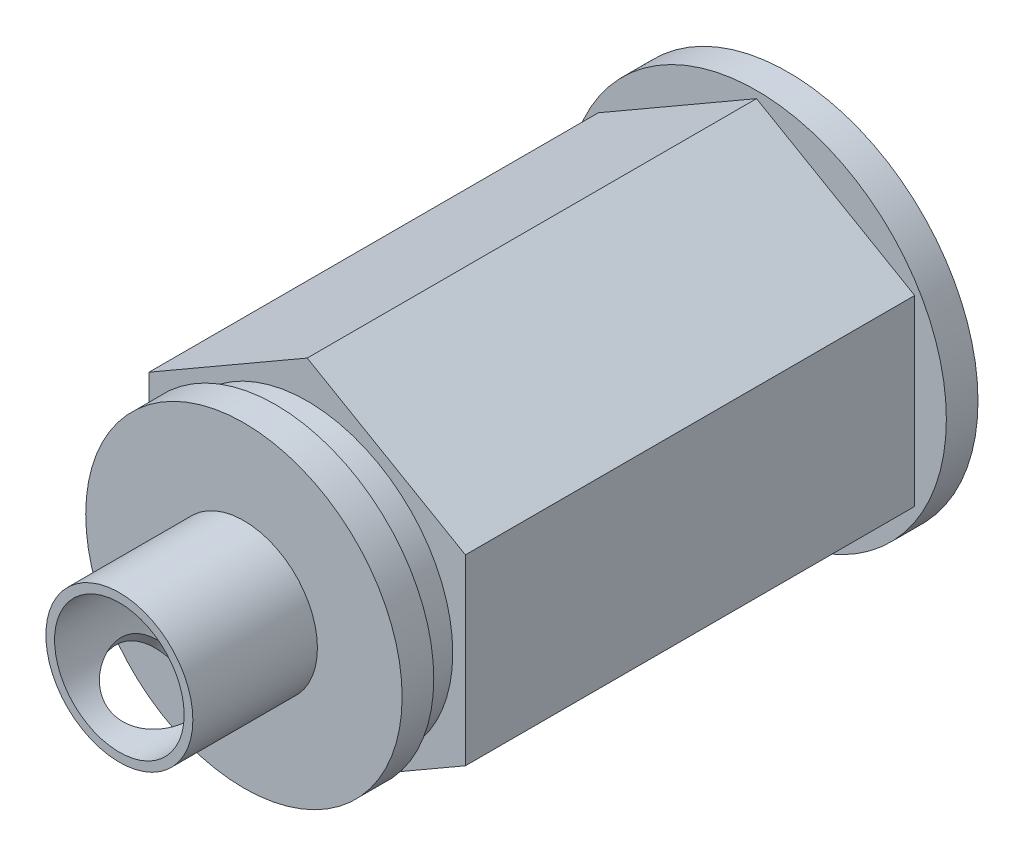
ISO-10303-21;
HEADER;
FILE_DESCRIPTION(('STEP AP214'),'2;1');
FILE_NAME('part.step','',(''),(''),'','','');
FILE_SCHEMA(('AUTOMOTIVE_DESIGN { 1 0 10303 214 1 1 1 1 }'));
ENDSEC;
DATA;
#1=APPLICATION_CONTEXT('core data for automotive mechanical design processes');
#2=APPLICATION_PROTOCOL_DEFINITION('international standard','automotive_design',2000,#1);
#3=PRODUCT_CONTEXT('',#1,'mechanical');
#4=PRODUCT('Part','Part','',(#3));
#5=PRODUCT_RELATED_PRODUCT_CATEGORY('part','',(#4));
#6=PRODUCT_DEFINITION_FORMATION('','',#4);
#7=PRODUCT_DEFINITION_CONTEXT('part definition',#1,'design');
#8=PRODUCT_DEFINITION('design','',#6,#7);
#9=PRODUCT_DEFINITION_SHAPE('','',#8);
#10=(LENGTH_UNIT() NAMED_UNIT(*) SI_UNIT(.MILLI.,.METRE.));
#11=(NAMED_UNIT(*) PLANE_ANGLE_UNIT() SI_UNIT($,.RADIAN.));
#12=(NAMED_UNIT(*) SI_UNIT($,.STERADIAN.) SOLID_ANGLE_UNIT());
#13=UNCERTAINTY_MEASURE_WITH_UNIT(LENGTH_MEASURE(1.E-05),#10,'distance_accuracy_value','');
#14=(GEOMETRIC_REPRESENTATION_CONTEXT(3) GLOBAL_UNCERTAINTY_ASSIGNED_CONTEXT((#13)) GLOBAL_UNIT_ASSIGNED_CONTEXT((#10,
#11,#12)) REPRESENTATION_CONTEXT('',''));
#15=CARTESIAN_POINT('',(0.,0.,0.));
#16=DIRECTION('',(0.,0.,1.));
#17=DIRECTION('',(1.,0.,0.));
#18=AXIS2_PLACEMENT_3D('',#15,#16,#17);
#19=CARTESIAN_POINT('',(0.,0.,21.844));
#20=DIRECTION('',(0.,0.,1.));
#21=DIRECTION('',(1.,0.,0.));
#22=AXIS2_PLACEMENT_3D('',#19,#20,#21);
#23=PLANE('',#22);
#24=CARTESIAN_POINT('',(0.,0.,21.844));
#25=DIRECTION('',(0.,0.,1.));
#26=DIRECTION('',(1.,0.,0.));
#27=AXIS2_PLACEMENT_3D('',#24,#25,#26);
#28=CIRCLE('',#27,2.525);
#29=CARTESIAN_POINT('',(2.525,0.,21.844));
#30=VERTEX_POINT('',#29);
#31=EDGE_CURVE('E170',#30,#30,#28,.T.);
#32=ORIENTED_EDGE('',*,*,#31,.F.);
#33=EDGE_LOOP('',(#32));
#34=FACE_BOUND('',#33,.T.);
#35=CARTESIAN_POINT('',(0.,0.,21.844));
#36=DIRECTION('',(0.,0.,1.));
#37=DIRECTION('',(1.,0.,0.));
#38=AXIS2_PLACEMENT_3D('',#35,#36,#37);
#39=CIRCLE('',#38,2.6);
#40=CARTESIAN_POINT('',(2.6,0.,21.844));
#41=VERTEX_POINT('',#40);
#42=EDGE_CURVE('E11',#41,#41,#39,.F.);
#43=ORIENTED_EDGE('',*,*,#42,.F.);
#44=EDGE_LOOP('',(#43));
#45=FACE_BOUND('',#44,.T.);
#46=ADVANCED_FACE('F33',(#34,#45),#23,.T.);
#47=CARTESIAN_POINT('',(0.,0.,19.304));
#48=DIRECTION('',(0.,0.,1.));
#49=DIRECTION('',(1.,0.,0.));
#50=AXIS2_PLACEMENT_3D('',#47,#48,#49);
#51=PLANE('',#50);
#52=DIRECTION('',(-0.866025403784441,0.499999999999995,0.));
#53=VECTOR('',#52,1.);
#54=CARTESIAN_POINT('',(6.34999999999996,3.6661742093542,19.304));
#55=LINE('',#54,#53);
#56=CARTESIAN_POINT('',(6.34999999999996,3.6661742093542,19.304));
#57=VERTEX_POINT('',#56);
#58=CARTESIAN_POINT('',(0.,7.33234841870825,19.304));
#59=VERTEX_POINT('',#58);
#60=EDGE_CURVE('E132',#57,#59,#55,.T.);
#61=ORIENTED_EDGE('',*,*,#60,.T.);
#62=DIRECTION('',(-0.866025403784438,-0.500000000000001,0.));
#63=VECTOR('',#62,1.);
#64=CARTESIAN_POINT('',(0.,7.33234841870825,19.304));
#65=LINE('',#64,#63);
#66=CARTESIAN_POINT('',(-6.35000000000001,3.66617420935411,19.304));
#67=VERTEX_POINT('',#66);
#68=EDGE_CURVE('E129',#59,#67,#65,.T.);
#69=ORIENTED_EDGE('',*,*,#68,.T.);
#70=DIRECTION('',(0.,-1.,0.));
#71=VECTOR('',#70,1.);
#72=CARTESIAN_POINT('',(-6.35000000000001,3.66617420935411,19.304));
#73=LINE('',#72,#71);
#74=CARTESIAN_POINT('',(-6.34999999999999,-3.66617420935416,19.304));
#75=VERTEX_POINT('',#74);
#76=EDGE_CURVE('E140',#67,#75,#73,.T.);
#77=ORIENTED_EDGE('',*,*,#76,.T.);
#78=DIRECTION('',(0.866025403784442,-0.499999999999995,0.));
#79=VECTOR('',#78,1.);
#80=CARTESIAN_POINT('',(-6.34999999999999,-3.66617420935416,19.304));
#81=LINE('',#80,#79);
#82=CARTESIAN_POINT('',(0.,-7.33234841870825,19.304));
#83=VERTEX_POINT('',#82);
#84=EDGE_CURVE('E142',#75,#83,#81,.T.);
#85=ORIENTED_EDGE('',*,*,#84,.T.);
#86=DIRECTION('',(0.866025403784435,0.500000000000007,0.));
#87=VECTOR('',#86,1.);
#88=CARTESIAN_POINT('',(0.,-7.33234841870825,19.304));
#89=LINE('',#88,#87);
#90=CARTESIAN_POINT('',(6.35000000000004,-3.66617420935407,19.304));
#91=VERTEX_POINT('',#90);
#92=EDGE_CURVE('E144',#83,#91,#89,.T.);
#93=ORIENTED_EDGE('',*,*,#92,.T.);
#94=DIRECTION('',(0.,1.,0.));
#95=VECTOR('',#94,1.);
#96=CARTESIAN_POINT('',(6.35000000000004,-3.66617420935407,19.304));
#97=LINE('',#96,#95);
#98=EDGE_CURVE('E61',#91,#57,#97,.T.);
#99=ORIENTED_EDGE('',*,*,#98,.T.);
#100=EDGE_LOOP('',(#61,#69,#77,#85,#93,#99));
#101=FACE_BOUND('',#100,.T.);
#102=CARTESIAN_POINT('',(0.,0.,19.304));
#103=DIRECTION('',(0.,0.,1.));
#104=DIRECTION('',(1.,0.,0.));
#105=AXIS2_PLACEMENT_3D('',#102,#103,#104);
#106=CIRCLE('',#105,5.842);
#107=CARTESIAN_POINT('',(5.842,0.,19.304));
#108=VERTEX_POINT('',#107);
#109=EDGE_CURVE('E161',#108,#108,#106,.T.);
#110=ORIENTED_EDGE('',*,*,#109,.F.);
#111=EDGE_LOOP('',(#110));
#112=FACE_BOUND('',#111,.T.);
#113=ADVANCED_FACE('F145',(#101,#112),#51,.T.);
#114=CARTESIAN_POINT('',(6.34999999999996,3.6661742093542,19.304));
#115=DIRECTION('',(-0.499999999999995,-0.866025403784441,0.));
#116=DIRECTION('',(0.866025403784441,-0.499999999999995,0.));
#117=AXIS2_PLACEMENT_3D('',#114,#115,#116);
#118=PLANE('',#117);
#119=DIRECTION('',(0.,0.,-1.));
#120=VECTOR('',#119,1.);
#121=CARTESIAN_POINT('',(6.34999999999996,3.6661742093542,19.304));
#122=LINE('',#121,#120);
#123=CARTESIAN_POINT('',(6.34999999999996,3.6661742093542,1.27));
#124=VERTEX_POINT('',#123);
#125=EDGE_CURVE('E110',#57,#124,#122,.T.);
#126=ORIENTED_EDGE('',*,*,#125,.T.);
#127=DIRECTION('',(-0.866025403784441,0.499999999999995,0.));
#128=VECTOR('',#127,1.);
#129=CARTESIAN_POINT('',(6.34999999999996,3.6661742093542,1.27));
#130=LINE('',#129,#128);
#131=CARTESIAN_POINT('',(0.,7.33234841870825,1.27));
#132=VERTEX_POINT('',#131);
#133=EDGE_CURVE('E53',#124,#132,#130,.T.);
#134=ORIENTED_EDGE('',*,*,#133,.T.);
#135=DIRECTION('',(0.,0.,-1.));
#136=VECTOR('',#135,1.);
#137=CARTESIAN_POINT('',(0.,7.33234841870825,19.304));
#138=LINE('',#137,#136);
#139=EDGE_CURVE('E96',#59,#132,#138,.T.);
#140=ORIENTED_EDGE('',*,*,#139,.F.);
#141=ORIENTED_EDGE('',*,*,#60,.F.);
#142=EDGE_LOOP('',(#126,#134,#140,#141));
#143=FACE_BOUND('',#142,.T.);
#144=ADVANCED_FACE('F35',(#143),#118,.F.);
#145=CARTESIAN_POINT('',(0.,7.33234841870825,19.304));
#146=DIRECTION('',(0.500000000000001,-0.866025403784438,0.));
#147=DIRECTION('',(0.866025403784438,0.500000000000001,0.));
#148=AXIS2_PLACEMENT_3D('',#145,#146,#147);
#149=PLANE('',#148);
#150=ORIENTED_EDGE('',*,*,#139,.T.);
#151=DIRECTION('',(-0.866025403784438,-0.500000000000001,0.));
#152=VECTOR('',#151,1.);
#153=CARTESIAN_POINT('',(0.,7.33234841870825,1.27));
#154=LINE('',#153,#152);
#155=CARTESIAN_POINT('',(-6.35000000000001,3.66617420935411,1.27));
#156=VERTEX_POINT('',#155);
#157=EDGE_CURVE('E128',#132,#156,#154,.T.);
#158=ORIENTED_EDGE('',*,*,#157,.T.);
#159=DIRECTION('',(0.,0.,-1.));
#160=VECTOR('',#159,1.);
#161=CARTESIAN_POINT('',(-6.35000000000001,3.66617420935411,19.304));
#162=LINE('',#161,#160);
#163=EDGE_CURVE('E119',#67,#156,#162,.T.);
#164=ORIENTED_EDGE('',*,*,#163,.F.);
#165=ORIENTED_EDGE('',*,*,#68,.F.);
#166=EDGE_LOOP('',(#150,#158,#164,#165));
#167=FACE_BOUND('',#166,.T.);
#168=ADVANCED_FACE('F126',(#167),#149,.F.);
#169=CARTESIAN_POINT('',(-6.35000000000001,3.66617420935411,19.304));
#170=DIRECTION('',(1.,0.,0.));
#171=DIRECTION('',(0.,1.,0.));
#172=AXIS2_PLACEMENT_3D('',#169,#170,#171);
#173=PLANE('',#172);
#174=ORIENTED_EDGE('',*,*,#163,.T.);
#175=DIRECTION('',(0.,-1.,0.));
#176=VECTOR('',#175,1.);
#177=CARTESIAN_POINT('',(-6.35000000000001,3.66617420935411,1.27));
#178=LINE('',#177,#176);
#179=CARTESIAN_POINT('',(-6.34999999999999,-3.66617420935416,1.27));
#180=VERTEX_POINT('',#179);
#181=EDGE_CURVE('E135',#156,#180,#178,.T.);
#182=ORIENTED_EDGE('',*,*,#181,.T.);
#183=DIRECTION('',(0.,0.,-1.));
#184=VECTOR('',#183,1.);
#185=CARTESIAN_POINT('',(-6.34999999999999,-3.66617420935416,19.304));
#186=LINE('',#185,#184);
#187=EDGE_CURVE('E112',#75,#180,#186,.T.);
#188=ORIENTED_EDGE('',*,*,#187,.F.);
#189=ORIENTED_EDGE('',*,*,#76,.F.);
#190=EDGE_LOOP('',(#174,#182,#188,#189));
#191=FACE_BOUND('',#190,.T.);
#192=ADVANCED_FACE('F271',(#191),#173,.F.);
#193=CARTESIAN_POINT('',(-6.34999999999999,-3.66617420935416,19.304));
#194=DIRECTION('',(0.499999999999995,0.866025403784442,0.));
#195=DIRECTION('',(-0.866025403784442,0.499999999999995,0.));
#196=AXIS2_PLACEMENT_3D('',#193,#194,#195);
#197=PLANE('',#196);
#198=ORIENTED_EDGE('',*,*,#187,.T.);
#199=DIRECTION('',(0.866025403784442,-0.499999999999995,0.));
#200=VECTOR('',#199,1.);
#201=CARTESIAN_POINT('',(-6.34999999999999,-3.66617420935416,1.27));
#202=LINE('',#201,#200);
#203=CARTESIAN_POINT('',(0.,-7.33234841870825,1.27));
#204=VERTEX_POINT('',#203);
#205=EDGE_CURVE('E106',#180,#204,#202,.T.);
#206=ORIENTED_EDGE('',*,*,#205,.T.);
#207=DIRECTION('',(0.,0.,-1.));
#208=VECTOR('',#207,1.);
#209=CARTESIAN_POINT('',(0.,-7.33234841870825,19.304));
#210=LINE('',#209,#208);
#211=EDGE_CURVE('E105',#83,#204,#210,.T.);
#212=ORIENTED_EDGE('',*,*,#211,.F.);
#213=ORIENTED_EDGE('',*,*,#84,.F.);
#214=EDGE_LOOP('',(#198,#206,#212,#213));
#215=FACE_BOUND('',#214,.T.);
#216=ADVANCED_FACE('F151',(#215),#197,.F.);
#217=CARTESIAN_POINT('',(0.,-7.33234841870825,19.304));
#218=DIRECTION('',(-0.500000000000007,0.866025403784435,0.));
#219=DIRECTION('',(-0.866025403784435,-0.500000000000007,0.));
#220=AXIS2_PLACEMENT_3D('',#217,#218,#219);
#221=PLANE('',#220);
#222=ORIENTED_EDGE('',*,*,#211,.T.);
#223=DIRECTION('',(0.866025403784435,0.500000000000007,0.));
#224=VECTOR('',#223,1.);
#225=CARTESIAN_POINT('',(0.,-7.33234841870825,1.27));
#226=LINE('',#225,#224);
#227=CARTESIAN_POINT('',(6.35000000000004,-3.66617420935407,1.27));
#228=VERTEX_POINT('',#227);
#229=EDGE_CURVE('E91',#204,#228,#226,.T.);
#230=ORIENTED_EDGE('',*,*,#229,.T.);
#231=DIRECTION('',(0.,0.,-1.));
#232=VECTOR('',#231,1.);
#233=CARTESIAN_POINT('',(6.35000000000004,-3.66617420935407,19.304));
#234=LINE('',#233,#232);
#235=EDGE_CURVE('E103',#91,#228,#234,.T.);
#236=ORIENTED_EDGE('',*,*,#235,.F.);
#237=ORIENTED_EDGE('',*,*,#92,.F.);
#238=EDGE_LOOP('',(#222,#230,#236,#237));
#239=FACE_BOUND('',#238,.T.);
#240=ADVANCED_FACE('F101',(#239),#221,.F.);
#241=CARTESIAN_POINT('',(6.35000000000004,-3.66617420935407,19.304));
#242=DIRECTION('',(-1.,0.,0.));
#243=DIRECTION('',(0.,-1.,0.));
#244=AXIS2_PLACEMENT_3D('',#241,#242,#243);
#245=PLANE('',#244);
#246=ORIENTED_EDGE('',*,*,#235,.T.);
#247=DIRECTION('',(0.,1.,0.));
#248=VECTOR('',#247,1.);
#249=CARTESIAN_POINT('',(6.35000000000004,-3.66617420935407,1.27));
#250=LINE('',#249,#248);
#251=EDGE_CURVE('E46',#228,#124,#250,.T.);
#252=ORIENTED_EDGE('',*,*,#251,.T.);
#253=ORIENTED_EDGE('',*,*,#125,.F.);
#254=ORIENTED_EDGE('',*,*,#98,.F.);
#255=EDGE_LOOP('',(#246,#252,#253,#254));
#256=FACE_BOUND('',#255,.T.);
#257=ADVANCED_FACE('F109',(#256),#245,.F.);
#258=CARTESIAN_POINT('',(0.,0.,1.27));
#259=DIRECTION('',(0.,0.,1.));
#260=DIRECTION('',(1.,0.,0.));
#261=AXIS2_PLACEMENT_3D('',#258,#259,#260);
#262=PLANE('',#261);
#263=CARTESIAN_POINT('',(0.,0.,1.27));
#264=DIRECTION('',(0.,0.,1.));
#265=DIRECTION('',(1.,0.,0.));
#266=AXIS2_PLACEMENT_3D('',#263,#264,#265);
#267=CIRCLE('',#266,7.62);
#268=CARTESIAN_POINT('',(7.62,0.,1.27));
#269=VERTEX_POINT('',#268);
#270=EDGE_CURVE('E107',#269,#269,#267,.T.);
#271=ORIENTED_EDGE('',*,*,#270,.T.);
#272=EDGE_LOOP('',(#271));
#273=FACE_BOUND('',#272,.T.);
#274=ORIENTED_EDGE('',*,*,#133,.F.);
#275=ORIENTED_EDGE('',*,*,#251,.F.);
#276=ORIENTED_EDGE('',*,*,#229,.F.);
#277=ORIENTED_EDGE('',*,*,#205,.F.);
#278=ORIENTED_EDGE('',*,*,#181,.F.);
#279=ORIENTED_EDGE('',*,*,#157,.F.);
#280=EDGE_LOOP('',(#274,#275,#276,#277,#278,#279));
#281=FACE_BOUND('',#280,.T.);
#282=ADVANCED_FACE('F90',(#273,#281),#262,.T.);
#283=CARTESIAN_POINT('',(0.,0.,1.27));
#284=DIRECTION('',(0.,0.,-1.));
#285=DIRECTION('',(-1.,0.,0.));
#286=AXIS2_PLACEMENT_3D('',#283,#284,#285);
#287=CYLINDRICAL_SURFACE('',#286,7.62);
#288=ORIENTED_EDGE('',*,*,#270,.F.);
#289=EDGE_LOOP('',(#288));
#290=FACE_BOUND('',#289,.T.);
#291=CARTESIAN_POINT('',(0.,0.,0.));
#292=DIRECTION('',(0.,0.,1.));
#293=DIRECTION('',(1.,0.,0.));
#294=AXIS2_PLACEMENT_3D('',#291,#292,#293);
#295=CIRCLE('',#294,7.62);
#296=CARTESIAN_POINT('',(7.62,0.,0.));
#297=VERTEX_POINT('',#296);
#298=EDGE_CURVE('E155',#297,#297,#295,.T.);
#299=ORIENTED_EDGE('',*,*,#298,.T.);
#300=EDGE_LOOP('',(#299));
#301=FACE_BOUND('',#300,.T.);
#302=ADVANCED_FACE('F255',(#290,#301),#287,.T.);
#303=CARTESIAN_POINT('',(0.,0.,0.));
#304=DIRECTION('',(0.,0.,1.));
#305=DIRECTION('',(1.,0.,0.));
#306=AXIS2_PLACEMENT_3D('',#303,#304,#305);
#307=PLANE('',#306);
#308=CARTESIAN_POINT('',(0.,0.,0.));
#309=DIRECTION('',(0.,0.,1.));
#310=DIRECTION('',(1.,0.,0.));
#311=AXIS2_PLACEMENT_3D('',#308,#309,#310);
#312=CIRCLE('',#311,2.525);
#313=CARTESIAN_POINT('',(2.525,0.,0.));
#314=VERTEX_POINT('',#313);
#315=EDGE_CURVE('E173',#314,#314,#312,.T.);
#316=ORIENTED_EDGE('',*,*,#315,.T.);
#317=EDGE_LOOP('',(#316));
#318=FACE_BOUND('',#317,.T.);
#319=ORIENTED_EDGE('',*,*,#298,.F.);
#320=EDGE_LOOP('',(#319));
#321=FACE_BOUND('',#320,.T.);
#322=ADVANCED_FACE('F249',(#318,#321),#307,.F.);
#323=CARTESIAN_POINT('',(0.,0.,20.574));
#324=DIRECTION('',(0.,0.,-1.));
#325=DIRECTION('',(-1.,0.,0.));
#326=AXIS2_PLACEMENT_3D('',#323,#324,#325);
#327=CYLINDRICAL_SURFACE('',#326,5.842);
#328=CARTESIAN_POINT('',(0.,0.,20.574));
#329=DIRECTION('',(0.,0.,1.));
#330=DIRECTION('',(1.,0.,0.));
#331=AXIS2_PLACEMENT_3D('',#328,#329,#330);
#332=CIRCLE('',#331,5.842);
#333=CARTESIAN_POINT('',(5.842,0.,20.574));
#334=VERTEX_POINT('',#333);
#335=EDGE_CURVE('E158',#334,#334,#332,.T.);
#336=ORIENTED_EDGE('',*,*,#335,.F.);
#337=EDGE_LOOP('',(#336));
#338=FACE_BOUND('',#337,.T.);
#339=ORIENTED_EDGE('',*,*,#109,.T.);
#340=EDGE_LOOP('',(#339));
#341=FACE_BOUND('',#340,.T.);
#342=ADVANCED_FACE('F244',(#338,#341),#327,.T.);
#343=CARTESIAN_POINT('',(0.,0.,20.574));
#344=DIRECTION('',(0.,0.,1.));
#345=DIRECTION('',(1.,0.,0.));
#346=AXIS2_PLACEMENT_3D('',#343,#344,#345);
#347=PLANE('',#346);
#348=CARTESIAN_POINT('',(0.,0.,20.574));
#349=DIRECTION('',(0.,0.,1.));
#350=DIRECTION('',(1.,0.,0.));
#351=AXIS2_PLACEMENT_3D('',#348,#349,#350);
#352=CIRCLE('',#351,6.35);
#353=CARTESIAN_POINT('',(-6.35,0.,20.574));
#354=VERTEX_POINT('',#353);
#355=EDGE_CURVE('E167',#354,#354,#352,.T.);
#356=ORIENTED_EDGE('',*,*,#355,.F.);
#357=EDGE_LOOP('',(#356));
#358=FACE_BOUND('',#357,.T.);
#359=ORIENTED_EDGE('',*,*,#335,.T.);
#360=EDGE_LOOP('',(#359));
#361=FACE_BOUND('',#360,.T.);
#362=ADVANCED_FACE('F233',(#358,#361),#347,.F.);
#363=CARTESIAN_POINT('',(0.,0.,21.844));
#364=DIRECTION('',(0.,0.,-1.));
#365=DIRECTION('',(-1.,0.,0.));
#366=AXIS2_PLACEMENT_3D('',#363,#364,#365);
#367=CYLINDRICAL_SURFACE('',#366,6.35);
#368=CARTESIAN_POINT('',(0.,0.,21.844));
#369=DIRECTION('',(0.,0.,1.));
#370=DIRECTION('',(1.,0.,0.));
#371=AXIS2_PLACEMENT_3D('',#368,#369,#370);
#372=CIRCLE('',#371,6.35);
#373=CARTESIAN_POINT('',(-6.35,0.,21.844));
#374=VERTEX_POINT('',#373);
#375=EDGE_CURVE('E164',#374,#374,#372,.T.);
#376=CARTESIAN_POINT('',(-6.35,0.,21.844));
#377=CARTESIAN_POINT('',(-6.35,0.,21.8307708333333));
#378=CARTESIAN_POINT('',(-6.35,0.,21.8175416666667));
#379=CARTESIAN_POINT('',(-6.35,0.,21.7910833333333));
#380=CARTESIAN_POINT('',(-6.35,0.,21.7778541666667));
#381=CARTESIAN_POINT('',(-6.35,0.,21.7513958333333));
#382=CARTESIAN_POINT('',(-6.35,0.,21.7381666666667));
#383=CARTESIAN_POINT('',(-6.35,0.,21.7117083333333));
#384=CARTESIAN_POINT('',(-6.35,0.,21.6984791666667));
#385=CARTESIAN_POINT('',(-6.35,0.,21.6720208333333));
#386=CARTESIAN_POINT('',(-6.35,0.,21.6587916666667));
#387=CARTESIAN_POINT('',(-6.35,0.,21.6323333333333));
#388=CARTESIAN_POINT('',(-6.35,0.,21.6191041666667));
#389=CARTESIAN_POINT('',(-6.35,0.,21.5926458333333));
#390=CARTESIAN_POINT('',(-6.35,0.,21.5794166666667));
#391=CARTESIAN_POINT('',(-6.35,0.,21.5529583333333));
#392=CARTESIAN_POINT('',(-6.35,0.,21.5397291666667));
#393=CARTESIAN_POINT('',(-6.35,0.,21.5132708333333));
#394=CARTESIAN_POINT('',(-6.35,0.,21.5000416666667));
#395=CARTESIAN_POINT('',(-6.35,0.,21.4735833333333));
#396=CARTESIAN_POINT('',(-6.35,0.,21.4603541666667));
#397=CARTESIAN_POINT('',(-6.35,0.,21.4338958333333));
#398=CARTESIAN_POINT('',(-6.35,0.,21.4206666666667));
#399=CARTESIAN_POINT('',(-6.35,0.,21.3942083333333));
#400=CARTESIAN_POINT('',(-6.35,0.,21.3809791666667));
#401=CARTESIAN_POINT('',(-6.35,0.,21.3545208333333));
#402=CARTESIAN_POINT('',(-6.35,0.,21.3412916666667));
#403=CARTESIAN_POINT('',(-6.35,0.,21.3148333333333));
#404=CARTESIAN_POINT('',(-6.35,0.,21.3016041666667));
#405=CARTESIAN_POINT('',(-6.35,0.,21.2751458333333));
#406=CARTESIAN_POINT('',(-6.35,0.,21.2619166666667));
#407=CARTESIAN_POINT('',(-6.35,0.,21.2354583333333));
#408=CARTESIAN_POINT('',(-6.35,0.,21.2222291666667));
#409=CARTESIAN_POINT('',(-6.35,0.,21.1957708333333));
#410=CARTESIAN_POINT('',(-6.35,0.,21.1825416666667));
#411=CARTESIAN_POINT('',(-6.35,0.,21.1560833333333));
#412=CARTESIAN_POINT('',(-6.35,0.,21.1428541666667));
#413=CARTESIAN_POINT('',(-6.35,0.,21.1163958333333));
#414=CARTESIAN_POINT('',(-6.35,0.,21.1031666666667));
#415=CARTESIAN_POINT('',(-6.35,0.,21.0767083333333));
#416=CARTESIAN_POINT('',(-6.35,0.,21.0634791666667));
#417=CARTESIAN_POINT('',(-6.35,0.,21.0370208333333));
#418=CARTESIAN_POINT('',(-6.35,0.,21.0237916666667));
#419=CARTESIAN_POINT('',(-6.35,0.,20.9973333333333));
#420=CARTESIAN_POINT('',(-6.35,0.,20.9841041666667));
#421=CARTESIAN_POINT('',(-6.35,0.,20.9576458333333));
#422=CARTESIAN_POINT('',(-6.35,0.,20.9444166666667));
#423=CARTESIAN_POINT('',(-6.35,0.,20.9179583333333));
#424=CARTESIAN_POINT('',(-6.35,0.,20.9047291666667));
#425=CARTESIAN_POINT('',(-6.35,0.,20.8782708333333));
#426=CARTESIAN_POINT('',(-6.35,0.,20.8650416666667));
#427=CARTESIAN_POINT('',(-6.35,0.,20.8385833333333));
#428=CARTESIAN_POINT('',(-6.35,0.,20.8253541666667));
#429=CARTESIAN_POINT('',(-6.35,0.,20.7988958333333));
#430=CARTESIAN_POINT('',(-6.35,0.,20.7856666666667));
#431=CARTESIAN_POINT('',(-6.35,0.,20.7592083333333));
#432=CARTESIAN_POINT('',(-6.35,0.,20.7459791666667));
#433=CARTESIAN_POINT('',(-6.35,0.,20.7195208333333));
#434=CARTESIAN_POINT('',(-6.35,0.,20.7062916666667));
#435=CARTESIAN_POINT('',(-6.35,0.,20.6798333333333));
#436=CARTESIAN_POINT('',(-6.35,0.,20.6666041666667));
#437=CARTESIAN_POINT('',(-6.35,0.,20.6401458333333));
#438=CARTESIAN_POINT('',(-6.35,0.,20.6269166666667));
#439=CARTESIAN_POINT('',(-6.35,0.,20.6004583333333));
#440=CARTESIAN_POINT('',(-6.35,0.,20.5872291666667));
#441=CARTESIAN_POINT('',(-6.35,0.,20.574));
#442=B_SPLINE_CURVE_WITH_KNOTS('',3,(#376,#377,#378,#379,#380,#381,#382,#383,#384,#385,#386,
#387,#388,#389,#390,#391,#392,#393,#394,#395,#396,#397,#398,#399,#400,#401,#402,#403,#404,#405,
#406,#407,#408,#409,#410,#411,#412,#413,#414,#415,#416,#417,#418,#419,#420,#421,#422,#423,#424,
#425,#426,#427,#428,#429,#430,#431,#432,#433,#434,#435,#436,#437,#438,#439,#440,#441),
.UNSPECIFIED.,.F.,.F.,(4,2,2,2,2,2,2,2,2,2,2,2,2,2,2,2,2,2,2,2,2,2,2,2,2,2,2,2,2,2,2,2,4),(0.,
0.0396874999999998,0.0793749999999996,0.119062499999999,0.158749999999999,0.198437499999999,
0.238124999999999,0.277812499999999,0.317499999999998,0.357187499999998,0.396874999999998,
0.436562499999998,0.476249999999998,0.515937499999997,0.555624999999997,0.595312499999997,
0.634999999999997,0.6746875,0.714375,0.7540625,0.793749999999999,0.833437499999999,
0.873124999999999,0.912812499999999,0.952499999999998,0.992187499999998,1.031875,1.0715625,
1.11125,1.1509375,1.190625,1.2303125,1.27),.UNSPECIFIED.);
#443=EDGE_CURVE('BSEAM228',#374,#354,#442,.T.);
#444=ORIENTED_EDGE('',*,*,#375,.F.);
#445=ORIENTED_EDGE('',*,*,#355,.T.);
#446=ORIENTED_EDGE('',*,*,#443,.T.);
#447=ORIENTED_EDGE('',*,*,#443,.F.);
#448=EDGE_LOOP('',(#444,#446,#445,#447));
#449=FACE_BOUND('',#448,.T.);
#450=ADVANCED_FACE('F228',(#449),#367,.T.);
#451=CARTESIAN_POINT('',(0.,0.,21.844));
#452=DIRECTION('',(0.,0.,1.));
#453=DIRECTION('',(1.,0.,0.));
#454=AXIS2_PLACEMENT_3D('',#451,#452,#453);
#455=CIRCLE('',#454,2.95);
#456=CARTESIAN_POINT('',(2.95,0.,21.844));
#457=VERTEX_POINT('',#456);
#458=EDGE_CURVE('E179',#457,#457,#455,.T.);
#459=ORIENTED_EDGE('',*,*,#458,.F.);
#460=EDGE_LOOP('',(#459));
#461=FACE_BOUND('',#460,.T.);
#462=ORIENTED_EDGE('',*,*,#375,.T.);
#463=EDGE_LOOP('',(#462));
#464=FACE_BOUND('',#463,.T.);
#465=ADVANCED_FACE('F214',(#461,#464),#23,.T.);
#466=CARTESIAN_POINT('',(0.,0.,21.844));
#467=DIRECTION('',(0.,0.,-1.));
#468=DIRECTION('',(-1.,0.,0.));
#469=AXIS2_PLACEMENT_3D('',#466,#467,#468);
#470=CYLINDRICAL_SURFACE('',#469,2.525);
#471=ORIENTED_EDGE('',*,*,#31,.T.);
#472=EDGE_LOOP('',(#471));
#473=FACE_BOUND('',#472,.T.);
#474=ORIENTED_EDGE('',*,*,#315,.F.);
#475=EDGE_LOOP('',(#474));
#476=FACE_BOUND('',#475,.T.);
#477=ADVANCED_FACE('F207',(#473,#476),#470,.F.);
#478=CARTESIAN_POINT('',(0.,0.,26.844));
#479=DIRECTION('',(0.,0.,1.));
#480=DIRECTION('',(1.,0.,0.));
#481=AXIS2_PLACEMENT_3D('',#478,#479,#480);
#482=PLANE('',#481);
#483=CARTESIAN_POINT('',(0.,0.,26.844));
#484=DIRECTION('',(0.,0.,1.));
#485=DIRECTION('',(1.,0.,0.));
#486=AXIS2_PLACEMENT_3D('',#483,#484,#485);
#487=CIRCLE('',#486,2.95);
#488=CARTESIAN_POINT('',(2.95,0.,26.844));
#489=VERTEX_POINT('',#488);
#490=EDGE_CURVE('E176',#489,#489,#487,.T.);
#491=ORIENTED_EDGE('',*,*,#490,.T.);
#492=EDGE_LOOP('',(#491));
#493=FACE_BOUND('',#492,.T.);
#494=CARTESIAN_POINT('',(0.,0.,26.844));
#495=DIRECTION('',(0.,0.,1.));
#496=DIRECTION('',(1.,0.,0.));
#497=AXIS2_PLACEMENT_3D('',#494,#495,#496);
#498=CIRCLE('',#497,2.6);
#499=CARTESIAN_POINT('',(2.6,0.,26.844));
#500=VERTEX_POINT('',#499);
#501=EDGE_CURVE('E182',#500,#500,#498,.T.);
#502=ORIENTED_EDGE('',*,*,#501,.F.);
#503=EDGE_LOOP('',(#502));
#504=FACE_BOUND('',#503,.T.);
#505=ADVANCED_FACE('F205',(#493,#504),#482,.T.);
#506=CARTESIAN_POINT('',(0.,0.,26.844));
#507=DIRECTION('',(0.,0.,-1.));
#508=DIRECTION('',(-1.,0.,0.));
#509=AXIS2_PLACEMENT_3D('',#506,#507,#508);
#510=CYLINDRICAL_SURFACE('',#509,2.95);
#511=CARTESIAN_POINT('',(0.0873493360647858,-2.94870651192842,24.384));
#512=CARTESIAN_POINT('',(0.0873401377426053,-2.94871039106813,24.303890426467));
#513=CARTESIAN_POINT('',(0.07998682012834,-2.9489530318462,24.223694750927));
#514=CARTESIAN_POINT('',(0.0511628537132931,-2.94958913628309,24.0658182959242));
#515=CARTESIAN_POINT('',(0.0296655838281833,-2.94998288376437,23.988142549201));
#516=CARTESIAN_POINT('',(-0.0257122995912384,-2.95001580164634,23.8378952255323));
#517=CARTESIAN_POINT('',(-0.059521541282585,-2.94965926559044,23.7652970489979));
#518=CARTESIAN_POINT('',(-0.137668953388783,-2.94704455159768,23.6260948986131));
#519=CARTESIAN_POINT('',(-0.182008576688249,-2.94478611114407,23.5594917536519));
#520=CARTESIAN_POINT('',(-0.283907000939298,-2.93679037151843,23.4274436031385));
#521=CARTESIAN_POINT('',(-0.342304795512964,-2.93075326749502,23.3626639174289));
#522=CARTESIAN_POINT('',(-0.467435647520263,-2.91341651264867,23.2424865430455));
#523=CARTESIAN_POINT('',(-0.534173219437768,-2.90211400244982,23.187093974358));
#524=CARTESIAN_POINT('',(-0.679289361047317,-2.87175272802848,23.0831103744527));
#525=CARTESIAN_POINT('',(-0.758167708453905,-2.85216756672674,23.0353617772823));
#526=CARTESIAN_POINT('',(-0.920361862442456,-2.80402713535482,22.9539888316261));
#527=CARTESIAN_POINT('',(-1.00367453554011,-2.77547813142766,22.9203546547633));
#528=CARTESIAN_POINT('',(-1.16495697014331,-2.71151428561374,22.8708813991708));
#529=CARTESIAN_POINT('',(-1.24284245314733,-2.67679996523499,22.853868622879));
#530=CARTESIAN_POINT('',(-1.39666688601618,-2.59984579442742,22.834231128231));
#531=CARTESIAN_POINT('',(-1.47260712305647,-2.55761107554794,22.831596637396));
#532=CARTESIAN_POINT('',(-1.61271669409034,-2.47138902326981,22.8403946290015));
#533=CARTESIAN_POINT('',(-1.67731674874666,-2.4279571334396,22.8505037729296));
#534=CARTESIAN_POINT('',(-1.80106808016548,-2.33763191541424,22.882099186858));
#535=CARTESIAN_POINT('',(-1.86021894429581,-2.29073832557035,22.9035863176101));
#536=CARTESIAN_POINT('',(-1.97269485617397,-2.19465717526491,22.9574028890801));
#537=CARTESIAN_POINT('',(-2.02593782269828,-2.14544826480739,22.989864524157));
#538=CARTESIAN_POINT('',(-2.12522318454607,-2.04714786373644,23.064492190929));
#539=CARTESIAN_POINT('',(-2.17126310798484,-1.99805641910021,23.1066615418273));
#540=CARTESIAN_POINT('',(-2.26033318362319,-1.89693990867716,23.2044021710785));
#541=CARTESIAN_POINT('',(-2.30258386482048,-1.84512264171173,23.2608991743342));
#542=CARTESIAN_POINT('',(-2.37840863752615,-1.74629897300105,23.3832436354928));
#543=CARTESIAN_POINT('',(-2.41197486412442,-1.69929695519682,23.4490994860313));
#544=CARTESIAN_POINT('',(-2.4728860244334,-1.60950187655431,23.5943163242919));
#545=CARTESIAN_POINT('',(-2.49957163997998,-1.56729278768309,23.6743210090871));
#546=CARTESIAN_POINT('',(-2.54339124986704,-1.49514500832045,23.8420994575565));
#547=CARTESIAN_POINT('',(-2.56053592013935,-1.46519261306199,23.9298644097986));
#548=CARTESIAN_POINT('',(-2.58435708721451,-1.42272679636661,24.1032670512179));
#549=CARTESIAN_POINT('',(-2.59176879614718,-1.40899770188995,24.1885015744971));
#550=CARTESIAN_POINT('',(-2.5985638865384,-1.39643392679975,24.3603496434111));
#551=CARTESIAN_POINT('',(-2.59795447737169,-1.39758587110283,24.44696188082));
#552=CARTESIAN_POINT('',(-2.58931958957856,-1.41349833458479,24.60734460754));
#553=CARTESIAN_POINT('',(-2.58224453161844,-1.42651427896395,24.681350538924));
#554=CARTESIAN_POINT('',(-2.56201563118195,-1.46253182287149,24.8260190387077));
#555=CARTESIAN_POINT('',(-2.54885952042469,-1.48553714832404,24.8966803486853));
#556=CARTESIAN_POINT('',(-2.51571590444981,-1.54102479480698,25.0363105932906));
#557=CARTESIAN_POINT('',(-2.49544752317224,-1.57388713181735,25.1050601329448));
#558=CARTESIAN_POINT('',(-2.44813223596219,-1.64651954510642,25.2362885558459));
#559=CARTESIAN_POINT('',(-2.42108185456329,-1.68629315988309,25.2987642009468));
#560=CARTESIAN_POINT('',(-2.35566267760561,-1.7767640092263,25.4249634187471));
#561=CARTESIAN_POINT('',(-2.31623211901843,-1.82821040344202,25.4876044740578));
#562=CARTESIAN_POINT('',(-2.22798959675473,-1.93477365239792,25.6023376062498));
#563=CARTESIAN_POINT('',(-2.17917337519341,-1.98989216558093,25.654424873205));
#564=CARTESIAN_POINT('',(-2.07011233565369,-2.10322140303208,25.7483252478698));
#565=CARTESIAN_POINT('',(-2.00950662810845,-2.16147044443631,25.7896780629067));
#566=CARTESIAN_POINT('',(-1.8788572044727,-2.27594172456063,25.8576364578495));
#567=CARTESIAN_POINT('',(-1.80882266558604,-2.33216586752448,25.8842562504193));
#568=CARTESIAN_POINT('',(-1.66824883110212,-2.43438962779678,25.919489740582));
#569=CARTESIAN_POINT('',(-1.59842182151794,-2.48085179428909,25.9296035372347));
#570=CARTESIAN_POINT('',(-1.45457040012107,-2.56783501563928,25.9360875008044));
#571=CARTESIAN_POINT('',(-1.38054781147012,-2.6083586240242,25.9324635929288));
#572=CARTESIAN_POINT('',(-1.23668742515998,-2.6793742462194,25.9124999629658));
#573=CARTESIAN_POINT('',(-1.16696890882542,-2.71039979995316,25.8971656665785));
#574=CARTESIAN_POINT('',(-1.02821291867699,-2.76602026658808,25.8556657714626));
#575=CARTESIAN_POINT('',(-0.959175534812364,-2.79061434081331,25.8294987612776));
#576=CARTESIAN_POINT('',(-0.821041529787077,-2.83440434786798,25.7660595996401));
#577=CARTESIAN_POINT('',(-0.752048389048739,-2.85335126892652,25.7283928150799));
#578=CARTESIAN_POINT('',(-0.618705975122113,-2.88520538594554,25.6435087455587));
#579=CARTESIAN_POINT('',(-0.554358766626951,-2.89810991041612,25.5962872494168));
#580=CARTESIAN_POINT('',(-0.425361620577165,-2.91998190697132,25.4877583997983));
#581=CARTESIAN_POINT('',(-0.361428627786683,-2.92837410736442,25.425480824597));
#582=CARTESIAN_POINT('',(-0.243478290242675,-2.94053444844682,25.2916364561533));
#583=CARTESIAN_POINT('',(-0.189471369690002,-2.9442977512785,25.2200600304931));
#584=CARTESIAN_POINT('',(-0.0915392999917154,-2.94900680529948,25.0652538278527));
#585=CARTESIAN_POINT('',(-0.0482270965265392,-2.94980768855855,24.9816281727182));
#586=CARTESIAN_POINT('',(0.0215927296425745,-2.95013217675234,24.8077600725098));
#587=CARTESIAN_POINT('',(0.0481557498235765,-2.94966001986712,24.7175405532695));
#588=CARTESIAN_POINT('',(0.0724901729613145,-2.94911657233669,24.585827420562));
#589=CARTESIAN_POINT('',(0.0780476330827107,-2.94896968873962,24.5456729071539));
#590=CARTESIAN_POINT('',(0.085479638688085,-2.94876367513877,24.4650196177042));
#591=CARTESIAN_POINT('',(0.0873539887370348,-2.9487045497917,24.4245208235088));
#592=CARTESIAN_POINT('',(0.0873493360647858,-2.94870651192842,24.384));
#593=B_SPLINE_CURVE_WITH_KNOTS('',3,(#511,#512,#513,#514,#515,#516,#517,#518,#519,#520,#521,
#522,#523,#524,#525,#526,#527,#528,#529,#530,#531,#532,#533,#534,#535,#536,#537,#538,#539,#540,
#541,#542,#543,#544,#545,#546,#547,#548,#549,#550,#551,#552,#553,#554,#555,#556,#557,#558,#559,
#560,#561,#562,#563,#564,#565,#566,#567,#568,#569,#570,#571,#572,#573,#574,#575,#576,#577,#578,
#579,#580,#581,#582,#583,#584,#585,#586,#587,#588,#589,#590,#591,#592),.UNSPECIFIED.,.T.,.F.,(4,
2,2,2,2,2,2,2,2,2,2,2,2,2,2,2,2,2,2,2,2,2,2,2,2,2,2,2,2,2,2,2,2,2,2,2,2,2,2,2,4),(0.,
0.240157632517549,0.480768576527344,0.720006355062369,0.959277160607743,1.22047227368132,
1.48180939425639,1.76310363710332,2.04420167834603,2.30359069032571,2.56280338159059,
2.79718539147534,3.03158513503905,3.26891539511451,3.50632692254924,3.76782927138118,
4.02956762233276,4.31102720113611,4.59217120151925,4.85055071640544,5.10869801585413,
5.33410320736259,5.55959254472804,5.79523307231559,6.03099460265359,6.30023375861322,
6.56959534661305,6.84909148559244,7.12831752795732,7.38037219172836,7.63231815421273,
7.86477276513853,8.0972576734448,8.33884368800068,8.58053641296534,8.84831583572342,
9.11637488898612,9.39738126314596,9.67745327257516,9.79892275845679,9.92039868963897),.UNSPECIFIED.);
#594=CARTESIAN_POINT('',(0.0873493360647858,-2.94870651192842,24.384));
#595=VERTEX_POINT('',#594);
#596=EDGE_CURVE('E187',#595,#595,#593,.T.);
#597=ORIENTED_EDGE('',*,*,#596,.T.);
#598=EDGE_LOOP('',(#597));
#599=FACE_BOUND('',#598,.T.);
#600=ORIENTED_EDGE('',*,*,#490,.F.);
#601=EDGE_LOOP('',(#600));
#602=FACE_BOUND('',#601,.T.);
#603=ORIENTED_EDGE('',*,*,#458,.T.);
#604=EDGE_LOOP('',(#603));
#605=FACE_BOUND('',#604,.T.);
#606=ADVANCED_FACE('F192',(#599,#602,#605),#510,.T.);
#607=CARTESIAN_POINT('',(0.,0.,26.844));
#608=DIRECTION('',(0.,0.,-1.));
#609=DIRECTION('',(-1.,0.,0.));
#610=AXIS2_PLACEMENT_3D('',#607,#608,#609);
#611=CYLINDRICAL_SURFACE('',#610,2.6);
#612=CARTESIAN_POINT('',(0.298608088608493,-2.58279561897909,24.384));
#613=CARTESIAN_POINT('',(0.298613105697072,-2.5827933088056,24.3058846560617));
#614=CARTESIAN_POINT('',(0.291237912239076,-2.58367904493331,24.2277851250821));
#615=CARTESIAN_POINT('',(0.262506417282509,-2.58675296799948,24.0742014174949));
#616=CARTESIAN_POINT('',(0.241135668247734,-2.58894250062784,23.9987200284566));
#617=CARTESIAN_POINT('',(0.18641826569326,-2.59345055881431,23.8529280032451));
#618=CARTESIAN_POINT('',(0.153156830481354,-2.59576806971389,23.7825847565655));
#619=CARTESIAN_POINT('',(0.0766296417164127,-2.59915235247309,23.6475792543194));
#620=CARTESIAN_POINT('',(0.0333608299543966,-2.6002187413893,23.5829187437242));
#621=CARTESIAN_POINT('',(-0.0671421986498506,-2.5996745720709,23.452560923407));
#622=CARTESIAN_POINT('',(-0.125431074954835,-2.59772587275083,23.3876779862577));
#623=CARTESIAN_POINT('',(-0.25029895316293,-2.58868203290697,23.266787576969));
#624=CARTESIAN_POINT('',(-0.316884032078993,-2.58158310123478,23.2107866800335));
#625=CARTESIAN_POINT('',(-0.463847627144642,-2.55947832226106,23.103372341397));
#626=CARTESIAN_POINT('',(-0.544940047827568,-2.54371314576682,23.0530768652076));
#627=CARTESIAN_POINT('',(-0.711991247684023,-2.50208944260979,22.9667252258));
#628=CARTESIAN_POINT('',(-0.797945543056714,-2.47624009025354,22.9306561795792));
#629=CARTESIAN_POINT('',(-0.962986931630648,-2.41652929509644,22.877419266271));
#630=CARTESIAN_POINT('',(-1.04195538852911,-2.38365582716699,22.8587873516516));
#631=CARTESIAN_POINT('',(-1.19784874989418,-2.30924066287146,22.836009418343));
#632=CARTESIAN_POINT('',(-1.27477547645396,-2.26770700986678,22.8318500209055));
#633=CARTESIAN_POINT('',(-1.41442286909539,-2.18294690606581,22.8378634181924));
#634=CARTESIAN_POINT('',(-1.47772958292585,-2.14055060882759,22.8463434732168));
#635=CARTESIAN_POINT('',(-1.598829918118,-2.05167811068803,22.8741861565124));
#636=CARTESIAN_POINT('',(-1.65662313126785,-2.00520160818245,22.8935495898434));
#637=CARTESIAN_POINT('',(-1.76597649449652,-1.90961794006227,22.9424444088231));
#638=CARTESIAN_POINT('',(-1.81749539135914,-1.86049613679346,22.972038643477));
#639=CARTESIAN_POINT('',(-1.91343660286094,-1.76167813545917,23.0403099070185));
#640=CARTESIAN_POINT('',(-1.95785703470841,-1.71198178873798,23.0789893389603));
#641=CARTESIAN_POINT('',(-2.04444653728919,-1.60790120786714,23.1695106055318));
#642=CARTESIAN_POINT('',(-2.08572346960742,-1.55366018976469,23.2223695347162));
#643=CARTESIAN_POINT('',(-2.15979284071501,-1.44893723519603,23.3371195206777));
#644=CARTESIAN_POINT('',(-2.19257378131362,-1.39846045821334,23.3990226423258));
#645=CARTESIAN_POINT('',(-2.25338794677749,-1.29847531576772,23.538446177575));
#646=CARTESIAN_POINT('',(-2.28045807877037,-1.24972909249095,23.6169419491304));
#647=CARTESIAN_POINT('',(-2.32523862022877,-1.16430443265326,23.7826594443662));
#648=CARTESIAN_POINT('',(-2.34296623543022,-1.12760385947801,23.8698647730371));
#649=CARTESIAN_POINT('',(-2.36624485482855,-1.07770529768345,24.0286033651678));
#650=CARTESIAN_POINT('',(-2.37371567648383,-1.06095110350157,24.0987367541074));
#651=CARTESIAN_POINT('',(-2.38364221808733,-1.03846449263524,24.2410692620151));
#652=CARTESIAN_POINT('',(-2.38610362368145,-1.03271958093907,24.3132659446389));
#653=CARTESIAN_POINT('',(-2.38603698601896,-1.03287331231699,24.4577325028879));
#654=CARTESIAN_POINT('',(-2.38350263323137,-1.03878667953773,24.5300023557041));
#655=CARTESIAN_POINT('',(-2.37341638142759,-1.06162315601647,24.6724349983511));
#656=CARTESIAN_POINT('',(-2.36586055401872,-1.07855488492708,24.742596093509));
#657=CARTESIAN_POINT('',(-2.34565489338817,-1.12181376078613,24.8791941863651));
#658=CARTESIAN_POINT('',(-2.33300085106754,-1.14814866897421,24.945628055098));
#659=CARTESIAN_POINT('',(-2.30244632337218,-1.20825314269946,25.0737270323081));
#660=CARTESIAN_POINT('',(-2.28454383729165,-1.24202554218317,25.1353903108869));
#661=CARTESIAN_POINT('',(-2.23955251473163,-1.32168403828474,25.263861956407));
#662=CARTESIAN_POINT('',(-2.21139427949273,-1.36865636618771,25.3296236968671));
#663=CARTESIAN_POINT('',(-2.14693545256322,-1.46770784979872,25.4528546239435));
#664=CARTESIAN_POINT('',(-2.11062718484861,-1.51979179363261,25.5103159084572));
#665=CARTESIAN_POINT('',(-2.02427203394569,-1.63340942114323,25.6225891206366));
#666=CARTESIAN_POINT('',(-1.97307193556945,-1.69530801717456,25.6761602573089));
#667=CARTESIAN_POINT('',(-1.85947136170566,-1.81917799061704,25.7696496071234));
#668=CARTESIAN_POINT('',(-1.79707861238139,-1.88114928871038,25.8095771833829));
#669=CARTESIAN_POINT('',(-1.6667712426752,-1.99722534562138,25.8713575263825));
#670=CARTESIAN_POINT('',(-1.59961005606195,-2.0515725920865,25.8943317806184));
#671=CARTESIAN_POINT('',(-1.45790881466584,-2.1545632139962,25.9254168990871));
#672=CARTESIAN_POINT('',(-1.38337694304138,-2.2032127869119,25.9335440560009));
#673=CARTESIAN_POINT('',(-1.23974878803236,-2.28670269570919,25.9343618864152));
#674=CARTESIAN_POINT('',(-1.17122029063636,-2.32251722699165,25.9289360305357));
#675=CARTESIAN_POINT('',(-1.03278021756997,-2.38730036609148,25.9067855900965));
#676=CARTESIAN_POINT('',(-0.962868617158515,-2.41626885132596,25.8900608032427));
#677=CARTESIAN_POINT('',(-0.824760670089614,-2.46680213695883,25.8464121591479));
#678=CARTESIAN_POINT('',(-0.756553893065971,-2.48846097468438,25.8196280199986));
#679=CARTESIAN_POINT('',(-0.622699786974753,-2.52528605613635,25.7568579901283));
#680=CARTESIAN_POINT('',(-0.557053049616257,-2.54045080685628,25.7208699864505));
#681=CARTESIAN_POINT('',(-0.42290236702291,-2.56638157680497,25.6363174803627));
#682=CARTESIAN_POINT('',(-0.35486666776796,-2.57648814168424,25.5868098234867));
#683=CARTESIAN_POINT('',(-0.225574079230127,-2.59101498450812,25.4788251172205));
#684=CARTESIAN_POINT('',(-0.164324979718066,-2.59542878876483,25.420337940902));
#685=CARTESIAN_POINT('',(-0.0433838627470827,-2.60042586597535,25.2875466413507));
#686=CARTESIAN_POINT('',(0.0151736241830165,-2.60046637868484,25.2121805401322));
#687=CARTESIAN_POINT('',(0.118364795314245,-2.59781867291447,25.0524537667098));
#688=CARTESIAN_POINT('',(0.163008202553678,-2.59513236552596,24.968099430968));
#689=CARTESIAN_POINT('',(0.231005361255708,-2.58991972277556,24.801499122258));
#690=CARTESIAN_POINT('',(0.256116068734198,-2.58740667845037,24.719979960732));
#691=CARTESIAN_POINT('',(0.289898684433891,-2.5838473098085,24.5536297950531));
#692=CARTESIAN_POINT('',(0.298602641828397,-2.58279812700875,24.4688055787417));
#693=CARTESIAN_POINT('',(0.298608088608493,-2.58279561897909,24.384));
#694=B_SPLINE_CURVE_WITH_KNOTS('',3,(#612,#613,#614,#615,#616,#617,#618,#619,#620,#621,#622,
#623,#624,#625,#626,#627,#628,#629,#630,#631,#632,#633,#634,#635,#636,#637,#638,#639,#640,#641,
#642,#643,#644,#645,#646,#647,#648,#649,#650,#651,#652,#653,#654,#655,#656,#657,#658,#659,#660,
#661,#662,#663,#664,#665,#666,#667,#668,#669,#670,#671,#672,#673,#674,#675,#676,#677,#678,#679,
#680,#681,#682,#683,#684,#685,#686,#687,#688,#689,#690,#691,#692,#693),.UNSPECIFIED.,.T.,.F.,(4,
2,2,2,2,2,2,2,2,2,2,2,2,2,2,2,2,2,2,2,2,2,2,2,2,2,2,2,2,2,2,2,2,2,2,2,2,2,2,2,4),(0.,
0.233990659873545,0.468223248593071,0.700809725276851,0.93346737346994,1.19416698638043,
1.45505869839772,1.7436440493674,2.03196746329298,2.29304451254287,2.55388015157855,
2.78277394347685,3.01168466921829,3.2420273712693,3.47243106820668,3.73016624596824,
3.98824843363916,4.27566389977332,4.5625481781735,4.7790925036228,4.99539091567405,
5.21196268280879,5.42870407780936,5.64562478293819,5.86262828595976,6.11837069555863,
6.37435499176226,6.6625142736021,6.95047540237001,7.21706594026689,7.4833637549748,
7.71476131793425,7.94616302390283,8.17446291585916,8.40281526637837,8.65605269430458,
8.90957784534477,9.19453536427607,9.47929330857839,9.73382195394627,9.98785288218991),.UNSPECIFIED.);
#695=CARTESIAN_POINT('',(0.298608088608493,-2.58279561897909,24.384));
#696=VERTEX_POINT('',#695);
#697=EDGE_CURVE('E37',#696,#696,#694,.T.);
#698=ORIENTED_EDGE('',*,*,#697,.F.);
#699=EDGE_LOOP('',(#698));
#700=FACE_BOUND('',#699,.T.);
#701=ORIENTED_EDGE('',*,*,#501,.T.);
#702=EDGE_LOOP('',(#701));
#703=FACE_BOUND('',#702,.T.);
#704=ORIENTED_EDGE('',*,*,#42,.T.);
#705=EDGE_LOOP('',(#704));
#706=FACE_BOUND('',#705,.T.);
#707=ADVANCED_FACE('F199',(#700,#703,#706),#611,.F.);
#708=CARTESIAN_POINT('',(-0.674999999999994,-1.169134295109,24.384));
#709=DIRECTION('',(-0.499999999999995,-0.866025403784442,0.));
#710=DIRECTION('',(0.866025403784442,-0.499999999999995,0.));
#711=AXIS2_PLACEMENT_3D('',#708,#709,#710);
#712=CYLINDRICAL_SURFACE('',#711,1.55);
#713=ORIENTED_EDGE('',*,*,#697,.T.);
#714=EDGE_LOOP('',(#713));
#715=FACE_BOUND('',#714,.T.);
#716=ORIENTED_EDGE('',*,*,#596,.F.);
#717=EDGE_LOOP('',(#716));
#718=FACE_BOUND('',#717,.T.);
#719=ADVANCED_FACE('F196',(#715,#718),#712,.F.);
#720=CLOSED_SHELL('',(#46,#113,#144,#168,#192,#216,#240,#257,#282,#302,#322,#342,#362,#450,#465,
#477,#505,#606,#707,#719));
#721=MANIFOLD_SOLID_BREP('B2',#720);
#722=ADVANCED_BREP_SHAPE_REPRESENTATION('',(#18,#721),#14);
#723=SHAPE_DEFINITION_REPRESENTATION(#9,#722);
ENDSEC;
END-ISO-10303-21;
